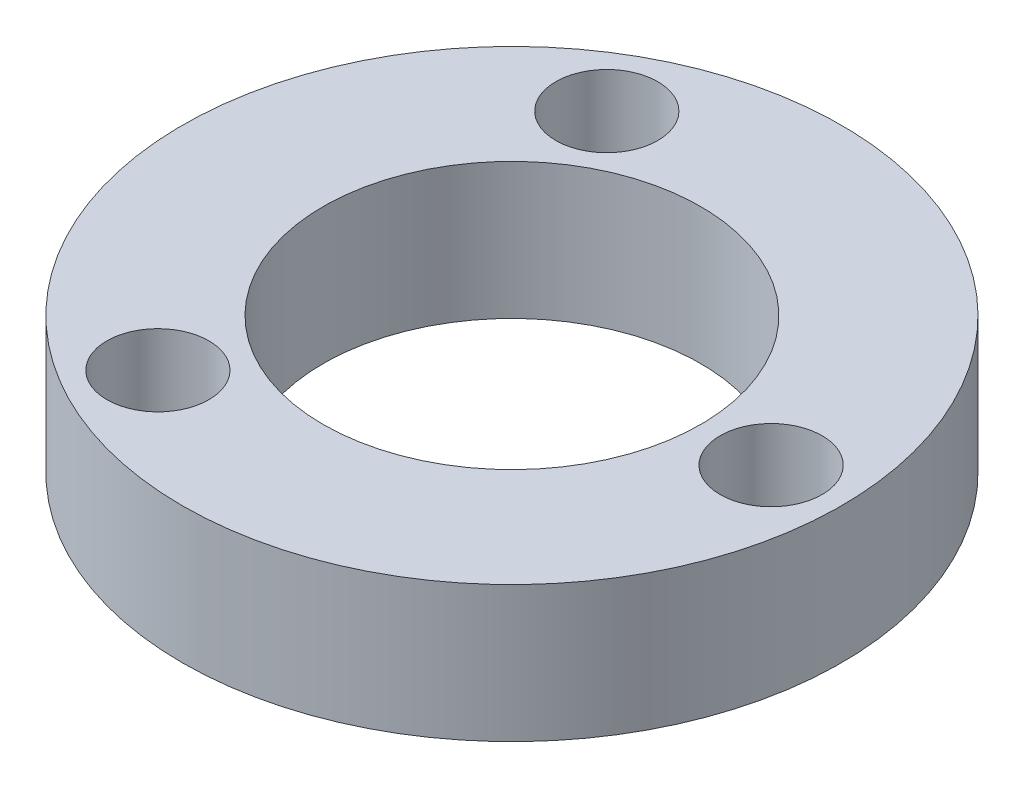
ISO-10303-21;
HEADER;
FILE_DESCRIPTION(('STEP AP214'),'2;1');
FILE_NAME('part.step','',(''),(''),'','','');
FILE_SCHEMA(('AUTOMOTIVE_DESIGN { 1 0 10303 214 1 1 1 1 }'));
ENDSEC;
DATA;
#1=APPLICATION_CONTEXT('core data for automotive mechanical design processes');
#2=APPLICATION_PROTOCOL_DEFINITION('international standard','automotive_design',2000,#1);
#3=PRODUCT_CONTEXT('',#1,'mechanical');
#4=PRODUCT('Part','Part','',(#3));
#5=PRODUCT_RELATED_PRODUCT_CATEGORY('part','',(#4));
#6=PRODUCT_DEFINITION_FORMATION('','',#4);
#7=PRODUCT_DEFINITION_CONTEXT('part definition',#1,'design');
#8=PRODUCT_DEFINITION('design','',#6,#7);
#9=PRODUCT_DEFINITION_SHAPE('','',#8);
#10=(LENGTH_UNIT() NAMED_UNIT(*) SI_UNIT(.MILLI.,.METRE.));
#11=(NAMED_UNIT(*) PLANE_ANGLE_UNIT() SI_UNIT($,.RADIAN.));
#12=(NAMED_UNIT(*) SI_UNIT($,.STERADIAN.) SOLID_ANGLE_UNIT());
#13=UNCERTAINTY_MEASURE_WITH_UNIT(LENGTH_MEASURE(1.E-05),#10,'distance_accuracy_value','');
#14=(GEOMETRIC_REPRESENTATION_CONTEXT(3) GLOBAL_UNCERTAINTY_ASSIGNED_CONTEXT((#13)) GLOBAL_UNIT_ASSIGNED_CONTEXT((#10,
#11,#12)) REPRESENTATION_CONTEXT('',''));
#15=CARTESIAN_POINT('',(0.,0.,0.));
#16=DIRECTION('',(0.,0.,1.));
#17=DIRECTION('',(1.,0.,0.));
#18=AXIS2_PLACEMENT_3D('',#15,#16,#17);
#19=CARTESIAN_POINT('',(0.,10.,0.));
#20=DIRECTION('',(0.,-1.,0.));
#21=DIRECTION('',(0.,0.,-1.));
#22=AXIS2_PLACEMENT_3D('',#19,#20,#21);
#23=CYLINDRICAL_SURFACE('',#22,13.8774999999999);
#24=CARTESIAN_POINT('',(0.,10.,0.));
#25=DIRECTION('',(0.,1.,0.));
#26=DIRECTION('',(0.,0.,1.));
#27=AXIS2_PLACEMENT_3D('',#24,#25,#26);
#28=CIRCLE('',#27,13.8774999999999);
#29=CARTESIAN_POINT('',(0.,10.,13.8774999999999));
#30=VERTEX_POINT('',#29);
#31=EDGE_CURVE('E39',#30,#30,#28,.T.);
#32=ORIENTED_EDGE('',*,*,#31,.T.);
#33=EDGE_LOOP('',(#32));
#34=FACE_BOUND('',#33,.T.);
#35=CARTESIAN_POINT('',(0.,0.,0.));
#36=DIRECTION('',(0.,1.,0.));
#37=DIRECTION('',(0.,0.,1.));
#38=AXIS2_PLACEMENT_3D('',#35,#36,#37);
#39=CIRCLE('',#38,13.8774999999999);
#40=CARTESIAN_POINT('',(0.,0.,13.8774999999999));
#41=VERTEX_POINT('',#40);
#42=EDGE_CURVE('E46',#41,#41,#39,.T.);
#43=ORIENTED_EDGE('',*,*,#42,.F.);
#44=EDGE_LOOP('',(#43));
#45=FACE_BOUND('',#44,.T.);
#46=ADVANCED_FACE('F32',(#34,#45),#23,.F.);
#47=CARTESIAN_POINT('',(0.,10.,0.));
#48=DIRECTION('',(0.,-1.,0.));
#49=DIRECTION('',(0.,0.,-1.));
#50=AXIS2_PLACEMENT_3D('',#47,#48,#49);
#51=CYLINDRICAL_SURFACE('',#50,24.2274999999999);
#52=CARTESIAN_POINT('',(0.,10.,0.));
#53=DIRECTION('',(0.,1.,0.));
#54=DIRECTION('',(0.,0.,1.));
#55=AXIS2_PLACEMENT_3D('',#52,#53,#54);
#56=CIRCLE('',#55,24.2274999999999);
#57=CARTESIAN_POINT('',(0.,10.,24.2274999999999));
#58=VERTEX_POINT('',#57);
#59=EDGE_CURVE('E10',#58,#58,#56,.T.);
#60=ORIENTED_EDGE('',*,*,#59,.F.);
#61=EDGE_LOOP('',(#60));
#62=FACE_BOUND('',#61,.T.);
#63=CARTESIAN_POINT('',(0.,0.,0.));
#64=DIRECTION('',(0.,1.,0.));
#65=DIRECTION('',(0.,0.,1.));
#66=AXIS2_PLACEMENT_3D('',#63,#64,#65);
#67=CIRCLE('',#66,24.2274999999999);
#68=CARTESIAN_POINT('',(0.,0.,24.2274999999999));
#69=VERTEX_POINT('',#68);
#70=EDGE_CURVE('E35',#69,#69,#67,.T.);
#71=ORIENTED_EDGE('',*,*,#70,.T.);
#72=EDGE_LOOP('',(#71));
#73=FACE_BOUND('',#72,.T.);
#74=ADVANCED_FACE('F85',(#62,#73),#51,.T.);
#75=CARTESIAN_POINT('',(0.,10.,0.));
#76=DIRECTION('',(0.,1.,0.));
#77=DIRECTION('',(0.,0.,1.));
#78=AXIS2_PLACEMENT_3D('',#75,#76,#77);
#79=PLANE('',#78);
#80=CARTESIAN_POINT('',(-9.52624999999981,10.,16.499949005603));
#81=DIRECTION('',(0.,1.,0.));
#82=DIRECTION('',(-0.866025403784443,0.,-0.499999999999992));
#83=AXIS2_PLACEMENT_3D('',#80,#81,#82);
#84=CIRCLE('',#83,3.75);
#85=CARTESIAN_POINT('',(-12.7738452641915,10.,14.624949005603));
#86=VERTEX_POINT('',#85);
#87=EDGE_CURVE('E66',#86,#86,#84,.T.);
#88=ORIENTED_EDGE('',*,*,#87,.F.);
#89=EDGE_LOOP('',(#88));
#90=FACE_BOUND('',#89,.T.);
#91=CARTESIAN_POINT('',(-9.52624999999997,10.,-16.4999490056029));
#92=DIRECTION('',(0.,1.,0.));
#93=DIRECTION('',(0.866025403784436,0.,-0.500000000000004));
#94=AXIS2_PLACEMENT_3D('',#91,#92,#93);
#95=CIRCLE('',#94,3.75);
#96=CARTESIAN_POINT('',(-6.27865473580833,10.,-18.3749490056029));
#97=VERTEX_POINT('',#96);
#98=EDGE_CURVE('E60',#97,#97,#95,.T.);
#99=ORIENTED_EDGE('',*,*,#98,.F.);
#100=EDGE_LOOP('',(#99));
#101=FACE_BOUND('',#100,.T.);
#102=CARTESIAN_POINT('',(19.0524999999998,10.,0.));
#103=DIRECTION('',(0.,1.,0.));
#104=DIRECTION('',(0.,0.,1.));
#105=AXIS2_PLACEMENT_3D('',#102,#103,#104);
#106=CIRCLE('',#105,3.75);
#107=CARTESIAN_POINT('',(19.0524999999998,10.,3.75000000000004));
#108=VERTEX_POINT('',#107);
#109=EDGE_CURVE('E53',#108,#108,#106,.T.);
#110=ORIENTED_EDGE('',*,*,#109,.F.);
#111=EDGE_LOOP('',(#110));
#112=FACE_BOUND('',#111,.T.);
#113=ORIENTED_EDGE('',*,*,#31,.F.);
#114=EDGE_LOOP('',(#113));
#115=FACE_BOUND('',#114,.T.);
#116=ORIENTED_EDGE('',*,*,#59,.T.);
#117=EDGE_LOOP('',(#116));
#118=FACE_BOUND('',#117,.T.);
#119=ADVANCED_FACE('F81',(#90,#101,#112,#115,#118),#79,.T.);
#120=CARTESIAN_POINT('',(0.,0.,0.));
#121=DIRECTION('',(0.,1.,0.));
#122=DIRECTION('',(0.,0.,1.));
#123=AXIS2_PLACEMENT_3D('',#120,#121,#122);
#124=PLANE('',#123);
#125=ORIENTED_EDGE('',*,*,#42,.T.);
#126=EDGE_LOOP('',(#125));
#127=FACE_BOUND('',#126,.T.);
#128=ORIENTED_EDGE('',*,*,#70,.F.);
#129=EDGE_LOOP('',(#128));
#130=FACE_BOUND('',#129,.T.);
#131=ADVANCED_FACE('F84',(#127,#130),#124,.F.);
#132=CARTESIAN_POINT('',(19.0524999999998,2.5,0.));
#133=DIRECTION('',(0.,1.,0.));
#134=DIRECTION('',(0.,0.,1.));
#135=AXIS2_PLACEMENT_3D('',#132,#133,#134);
#136=CYLINDRICAL_SURFACE('',#135,3.75);
#137=CARTESIAN_POINT('',(19.0524999999998,2.5,0.));
#138=DIRECTION('',(0.,1.,0.));
#139=DIRECTION('',(0.,0.,1.));
#140=AXIS2_PLACEMENT_3D('',#137,#138,#139);
#141=CIRCLE('',#140,3.75);
#142=CARTESIAN_POINT('',(19.0524999999998,2.5,3.75000000000004));
#143=VERTEX_POINT('',#142);
#144=EDGE_CURVE('E48',#143,#143,#141,.T.);
#145=ORIENTED_EDGE('',*,*,#144,.F.);
#146=EDGE_LOOP('',(#145));
#147=FACE_BOUND('',#146,.T.);
#148=ORIENTED_EDGE('',*,*,#109,.T.);
#149=EDGE_LOOP('',(#148));
#150=FACE_BOUND('',#149,.T.);
#151=ADVANCED_FACE('F104',(#147,#150),#136,.F.);
#152=CARTESIAN_POINT('',(19.0524999999998,2.5,0.));
#153=DIRECTION('',(0.,1.,0.));
#154=DIRECTION('',(0.,0.,1.));
#155=AXIS2_PLACEMENT_3D('',#152,#153,#154);
#156=PLANE('',#155);
#157=ORIENTED_EDGE('',*,*,#144,.T.);
#158=EDGE_LOOP('',(#157));
#159=FACE_BOUND('',#158,.T.);
#160=ADVANCED_FACE('F108',(#159),#156,.T.);
#161=CARTESIAN_POINT('',(-9.52624999999997,2.5,-16.4999490056029));
#162=DIRECTION('',(0.,1.,0.));
#163=DIRECTION('',(0.,0.,1.));
#164=AXIS2_PLACEMENT_3D('',#161,#162,#163);
#165=CYLINDRICAL_SURFACE('',#164,3.75);
#166=CARTESIAN_POINT('',(-9.52624999999997,2.5,-16.4999490056029));
#167=DIRECTION('',(0.,1.,0.));
#168=DIRECTION('',(0.866025403784436,0.,-0.500000000000004));
#169=AXIS2_PLACEMENT_3D('',#166,#167,#168);
#170=CIRCLE('',#169,3.75);
#171=CARTESIAN_POINT('',(-6.27865473580833,2.5,-18.3749490056029));
#172=VERTEX_POINT('',#171);
#173=EDGE_CURVE('E58',#172,#172,#170,.T.);
#174=ORIENTED_EDGE('',*,*,#173,.F.);
#175=EDGE_LOOP('',(#174));
#176=FACE_BOUND('',#175,.T.);
#177=ORIENTED_EDGE('',*,*,#98,.T.);
#178=EDGE_LOOP('',(#177));
#179=FACE_BOUND('',#178,.T.);
#180=ADVANCED_FACE('F112',(#176,#179),#165,.F.);
#181=CARTESIAN_POINT('',(-9.52624999999997,2.5,-16.4999490056029));
#182=DIRECTION('',(0.,1.,0.));
#183=DIRECTION('',(0.866025403784436,0.,-0.500000000000004));
#184=AXIS2_PLACEMENT_3D('',#181,#182,#183);
#185=PLANE('',#184);
#186=ORIENTED_EDGE('',*,*,#173,.T.);
#187=EDGE_LOOP('',(#186));
#188=FACE_BOUND('',#187,.T.);
#189=ADVANCED_FACE('F77',(#188),#185,.T.);
#190=CARTESIAN_POINT('',(-9.52624999999981,2.5,16.499949005603));
#191=DIRECTION('',(0.,1.,0.));
#192=DIRECTION('',(0.,0.,1.));
#193=AXIS2_PLACEMENT_3D('',#190,#191,#192);
#194=CYLINDRICAL_SURFACE('',#193,3.75);
#195=CARTESIAN_POINT('',(-9.52624999999981,2.5,16.499949005603));
#196=DIRECTION('',(0.,1.,0.));
#197=DIRECTION('',(-0.866025403784443,0.,-0.499999999999992));
#198=AXIS2_PLACEMENT_3D('',#195,#196,#197);
#199=CIRCLE('',#198,3.75);
#200=CARTESIAN_POINT('',(-12.7738452641915,2.5,14.624949005603));
#201=VERTEX_POINT('',#200);
#202=EDGE_CURVE('E63',#201,#201,#199,.T.);
#203=ORIENTED_EDGE('',*,*,#202,.F.);
#204=EDGE_LOOP('',(#203));
#205=FACE_BOUND('',#204,.T.);
#206=ORIENTED_EDGE('',*,*,#87,.T.);
#207=EDGE_LOOP('',(#206));
#208=FACE_BOUND('',#207,.T.);
#209=ADVANCED_FACE('F74',(#205,#208),#194,.F.);
#210=CARTESIAN_POINT('',(-9.52624999999981,2.5,16.499949005603));
#211=DIRECTION('',(0.,1.,0.));
#212=DIRECTION('',(-0.866025403784443,0.,-0.499999999999992));
#213=AXIS2_PLACEMENT_3D('',#210,#211,#212);
#214=PLANE('',#213);
#215=ORIENTED_EDGE('',*,*,#202,.T.);
#216=EDGE_LOOP('',(#215));
#217=FACE_BOUND('',#216,.T.);
#218=ADVANCED_FACE('F72',(#217),#214,.T.);
#219=CLOSED_SHELL('',(#46,#74,#119,#131,#151,#160,#180,#189,#209,#218));
#220=MANIFOLD_SOLID_BREP('B2',#219);
#221=ADVANCED_BREP_SHAPE_REPRESENTATION('',(#18,#220),#14);
#222=SHAPE_DEFINITION_REPRESENTATION(#9,#221);
ENDSEC;
END-ISO-10303-21;
